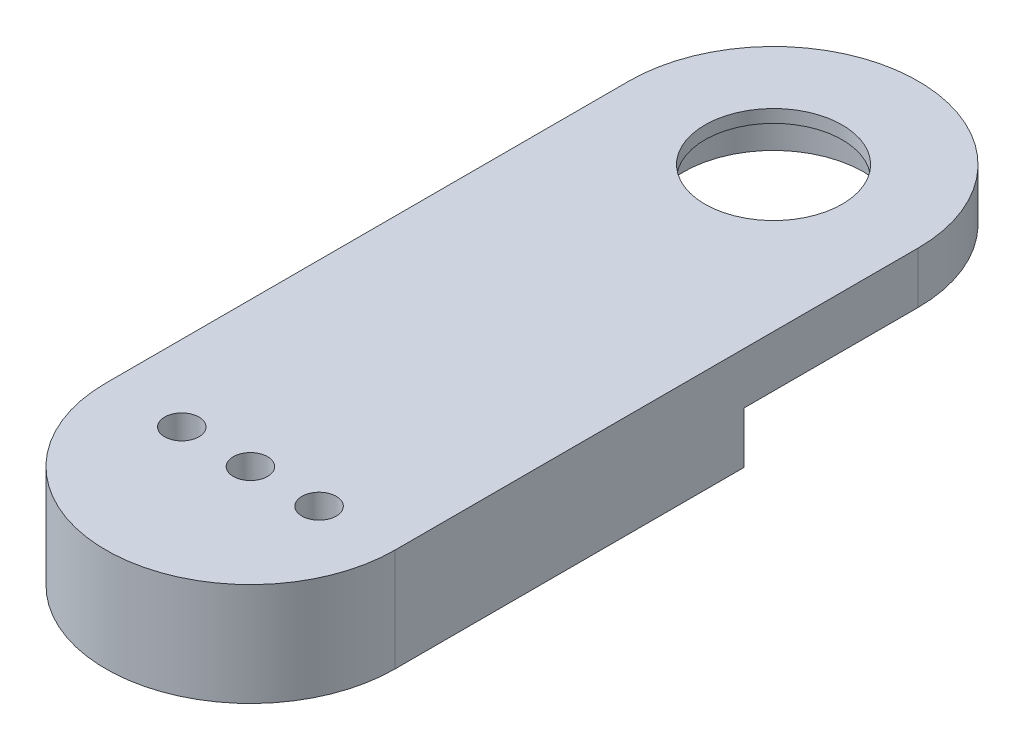
ISO-10303-21;
HEADER;
FILE_DESCRIPTION(('STEP AP214'),'2;1');
FILE_NAME('part.step','',(''),(''),'','','');
FILE_SCHEMA(('AUTOMOTIVE_DESIGN { 1 0 10303 214 1 1 1 1 }'));
ENDSEC;
DATA;
#1=APPLICATION_CONTEXT('core data for automotive mechanical design processes');
#2=APPLICATION_PROTOCOL_DEFINITION('international standard','automotive_design',2000,#1);
#3=PRODUCT_CONTEXT('',#1,'mechanical');
#4=PRODUCT('Part','Part','',(#3));
#5=PRODUCT_RELATED_PRODUCT_CATEGORY('part','',(#4));
#6=PRODUCT_DEFINITION_FORMATION('','',#4);
#7=PRODUCT_DEFINITION_CONTEXT('part definition',#1,'design');
#8=PRODUCT_DEFINITION('design','',#6,#7);
#9=PRODUCT_DEFINITION_SHAPE('','',#8);
#10=(LENGTH_UNIT() NAMED_UNIT(*) SI_UNIT(.MILLI.,.METRE.));
#11=(NAMED_UNIT(*) PLANE_ANGLE_UNIT() SI_UNIT($,.RADIAN.));
#12=(NAMED_UNIT(*) SI_UNIT($,.STERADIAN.) SOLID_ANGLE_UNIT());
#13=UNCERTAINTY_MEASURE_WITH_UNIT(LENGTH_MEASURE(1.E-05),#10,'distance_accuracy_value','');
#14=(GEOMETRIC_REPRESENTATION_CONTEXT(3) GLOBAL_UNCERTAINTY_ASSIGNED_CONTEXT((#13)) GLOBAL_UNIT_ASSIGNED_CONTEXT((#10,
#11,#12)) REPRESENTATION_CONTEXT('',''));
#15=CARTESIAN_POINT('',(0.,0.,0.));
#16=DIRECTION('',(0.,0.,1.));
#17=DIRECTION('',(1.,0.,0.));
#18=AXIS2_PLACEMENT_3D('',#15,#16,#17);
#19=CARTESIAN_POINT('',(0.,12.,-60.96));
#20=DIRECTION('',(0.,-1.,0.));
#21=DIRECTION('',(0.,0.,-1.));
#22=AXIS2_PLACEMENT_3D('',#19,#20,#21);
#23=CYLINDRICAL_SURFACE('',#22,10.499999955);
#24=CARTESIAN_POINT('',(0.,6.,-60.96));
#25=DIRECTION('',(0.,-1.,0.));
#26=DIRECTION('',(0.,0.,-1.));
#27=AXIS2_PLACEMENT_3D('',#24,#25,#26);
#28=CIRCLE('',#27,10.499999955);
#29=CARTESIAN_POINT('',(0.,6.,-71.459999955));
#30=VERTEX_POINT('',#29);
#31=EDGE_CURVE('E149',#30,#30,#28,.F.);
#32=ORIENTED_EDGE('',*,*,#31,.F.);
#33=EDGE_LOOP('',(#32));
#34=FACE_BOUND('',#33,.T.);
#35=CARTESIAN_POINT('',(0.,10.5,-60.96));
#36=DIRECTION('',(0.,1.,0.));
#37=DIRECTION('',(0.,0.,1.));
#38=AXIS2_PLACEMENT_3D('',#35,#36,#37);
#39=CIRCLE('',#38,10.499999955);
#40=CARTESIAN_POINT('',(0.,10.5,-50.460000045));
#41=VERTEX_POINT('',#40);
#42=EDGE_CURVE('E154',#41,#41,#39,.T.);
#43=ORIENTED_EDGE('',*,*,#42,.T.);
#44=EDGE_LOOP('',(#43));
#45=FACE_BOUND('',#44,.T.);
#46=ADVANCED_FACE('F34',(#34,#45),#23,.F.);
#47=CARTESIAN_POINT('',(0.,0.,0.));
#48=DIRECTION('',(0.,1.,0.));
#49=DIRECTION('',(0.,0.,1.));
#50=AXIS2_PLACEMENT_3D('',#47,#48,#49);
#51=PLANE('',#50);
#52=CARTESIAN_POINT('',(0.,0.,0.));
#53=DIRECTION('',(0.,1.,0.));
#54=DIRECTION('',(0.,0.,1.));
#55=AXIS2_PLACEMENT_3D('',#52,#53,#54);
#56=CIRCLE('',#55,2.);
#57=CARTESIAN_POINT('',(0.,0.,2.));
#58=VERTEX_POINT('',#57);
#59=EDGE_CURVE('E141',#58,#58,#56,.T.);
#60=ORIENTED_EDGE('',*,*,#59,.T.);
#61=EDGE_LOOP('',(#60));
#62=FACE_BOUND('',#61,.T.);
#63=CARTESIAN_POINT('',(8.,0.,0.));
#64=DIRECTION('',(0.,1.,0.));
#65=DIRECTION('',(0.,0.,1.));
#66=AXIS2_PLACEMENT_3D('',#63,#64,#65);
#67=CIRCLE('',#66,2.);
#68=CARTESIAN_POINT('',(8.,0.,2.));
#69=VERTEX_POINT('',#68);
#70=EDGE_CURVE('E135',#69,#69,#67,.T.);
#71=ORIENTED_EDGE('',*,*,#70,.T.);
#72=EDGE_LOOP('',(#71));
#73=FACE_BOUND('',#72,.T.);
#74=CARTESIAN_POINT('',(-8.,0.,0.));
#75=DIRECTION('',(0.,1.,0.));
#76=DIRECTION('',(0.,0.,1.));
#77=AXIS2_PLACEMENT_3D('',#74,#75,#76);
#78=CIRCLE('',#77,2.);
#79=CARTESIAN_POINT('',(-8.,0.,2.));
#80=VERTEX_POINT('',#79);
#81=EDGE_CURVE('E129',#80,#80,#78,.T.);
#82=ORIENTED_EDGE('',*,*,#81,.T.);
#83=EDGE_LOOP('',(#82));
#84=FACE_BOUND('',#83,.T.);
#85=DIRECTION('',(1.,0.,0.));
#86=VECTOR('',#85,1.);
#87=CARTESIAN_POINT('',(0.,0.,-40.64));
#88=LINE('',#87,#86);
#89=CARTESIAN_POINT('',(-16.85,0.,-40.64));
#90=VERTEX_POINT('',#89);
#91=CARTESIAN_POINT('',(16.85,0.,-40.64));
#92=VERTEX_POINT('',#91);
#93=EDGE_CURVE('E151',#90,#92,#88,.T.);
#94=ORIENTED_EDGE('',*,*,#93,.T.);
#95=DIRECTION('',(0.,0.,-1.));
#96=VECTOR('',#95,1.);
#97=CARTESIAN_POINT('',(16.85,0.,0.));
#98=LINE('',#97,#96);
#99=CARTESIAN_POINT('',(16.85,0.,0.));
#100=VERTEX_POINT('',#99);
#101=EDGE_CURVE('E117',#100,#92,#98,.T.);
#102=ORIENTED_EDGE('',*,*,#101,.F.);
#103=CARTESIAN_POINT('',(0.,0.,0.));
#104=DIRECTION('',(0.,1.,0.));
#105=DIRECTION('',(0.,0.,1.));
#106=AXIS2_PLACEMENT_3D('',#103,#104,#105);
#107=CIRCLE('',#106,16.85);
#108=CARTESIAN_POINT('',(-16.85,0.,0.));
#109=VERTEX_POINT('',#108);
#110=EDGE_CURVE('E120',#109,#100,#107,.T.);
#111=ORIENTED_EDGE('',*,*,#110,.F.);
#112=DIRECTION('',(0.,0.,1.));
#113=VECTOR('',#112,1.);
#114=CARTESIAN_POINT('',(-16.85,0.,0.));
#115=LINE('',#114,#113);
#116=EDGE_CURVE('E73',#90,#109,#115,.T.);
#117=ORIENTED_EDGE('',*,*,#116,.F.);
#118=EDGE_LOOP('',(#94,#102,#111,#117));
#119=FACE_BOUND('',#118,.T.);
#120=ADVANCED_FACE('F192',(#62,#73,#84,#119),#51,.F.);
#121=CARTESIAN_POINT('',(16.85,12.,0.));
#122=DIRECTION('',(-1.,0.,0.));
#123=DIRECTION('',(0.,0.,1.));
#124=AXIS2_PLACEMENT_3D('',#121,#122,#123);
#125=PLANE('',#124);
#126=DIRECTION('',(0.,-1.,0.));
#127=VECTOR('',#126,1.);
#128=CARTESIAN_POINT('',(16.85,6.,-40.64));
#129=LINE('',#128,#127);
#130=CARTESIAN_POINT('',(16.85,6.,-40.64));
#131=VERTEX_POINT('',#130);
#132=EDGE_CURVE('E144',#131,#92,#129,.T.);
#133=ORIENTED_EDGE('',*,*,#132,.F.);
#134=DIRECTION('',(0.,0.,1.));
#135=VECTOR('',#134,1.);
#136=CARTESIAN_POINT('',(16.85,6.,0.));
#137=LINE('',#136,#135);
#138=CARTESIAN_POINT('',(16.85,6.,-60.96));
#139=VERTEX_POINT('',#138);
#140=EDGE_CURVE('E108',#139,#131,#137,.T.);
#141=ORIENTED_EDGE('',*,*,#140,.F.);
#142=DIRECTION('',(0.,-1.,0.));
#143=VECTOR('',#142,1.);
#144=CARTESIAN_POINT('',(16.85,12.,-60.96));
#145=LINE('',#144,#143);
#146=CARTESIAN_POINT('',(16.85,12.,-60.96));
#147=VERTEX_POINT('',#146);
#148=EDGE_CURVE('E42',#147,#139,#145,.T.);
#149=ORIENTED_EDGE('',*,*,#148,.F.);
#150=DIRECTION('',(0.,0.,-1.));
#151=VECTOR('',#150,1.);
#152=CARTESIAN_POINT('',(16.85,12.,0.));
#153=LINE('',#152,#151);
#154=CARTESIAN_POINT('',(16.85,12.,0.));
#155=VERTEX_POINT('',#154);
#156=EDGE_CURVE('E80',#155,#147,#153,.T.);
#157=ORIENTED_EDGE('',*,*,#156,.F.);
#158=DIRECTION('',(0.,-1.,0.));
#159=VECTOR('',#158,1.);
#160=CARTESIAN_POINT('',(16.85,12.,0.));
#161=LINE('',#160,#159);
#162=EDGE_CURVE('E11',#155,#100,#161,.T.);
#163=ORIENTED_EDGE('',*,*,#162,.T.);
#164=ORIENTED_EDGE('',*,*,#101,.T.);
#165=EDGE_LOOP('',(#133,#141,#149,#157,#163,#164));
#166=FACE_BOUND('',#165,.T.);
#167=ADVANCED_FACE('F197',(#166),#125,.F.);
#168=CARTESIAN_POINT('',(0.,12.,-60.96));
#169=DIRECTION('',(0.,-1.,0.));
#170=DIRECTION('',(0.,0.,-1.));
#171=AXIS2_PLACEMENT_3D('',#168,#169,#170);
#172=CYLINDRICAL_SURFACE('',#171,16.85);
#173=CARTESIAN_POINT('',(0.,6.,-60.96));
#174=DIRECTION('',(0.,-1.,0.));
#175=DIRECTION('',(0.,0.,-1.));
#176=AXIS2_PLACEMENT_3D('',#173,#174,#175);
#177=CIRCLE('',#176,16.85);
#178=CARTESIAN_POINT('',(-16.85,6.,-60.96));
#179=VERTEX_POINT('',#178);
#180=EDGE_CURVE('E98',#179,#139,#177,.T.);
#181=ORIENTED_EDGE('',*,*,#180,.F.);
#182=DIRECTION('',(0.,-1.,0.));
#183=VECTOR('',#182,1.);
#184=CARTESIAN_POINT('',(-16.85,12.,-60.96));
#185=LINE('',#184,#183);
#186=CARTESIAN_POINT('',(-16.85,12.,-60.96));
#187=VERTEX_POINT('',#186);
#188=EDGE_CURVE('E107',#187,#179,#185,.T.);
#189=ORIENTED_EDGE('',*,*,#188,.F.);
#190=CARTESIAN_POINT('',(0.,12.,-60.96));
#191=DIRECTION('',(0.,1.,0.));
#192=DIRECTION('',(0.,0.,1.));
#193=AXIS2_PLACEMENT_3D('',#190,#191,#192);
#194=CIRCLE('',#193,16.85);
#195=EDGE_CURVE('E125',#147,#187,#194,.T.);
#196=ORIENTED_EDGE('',*,*,#195,.F.);
#197=ORIENTED_EDGE('',*,*,#148,.T.);
#198=EDGE_LOOP('',(#181,#189,#196,#197));
#199=FACE_BOUND('',#198,.T.);
#200=ADVANCED_FACE('F105',(#199),#172,.T.);
#201=CARTESIAN_POINT('',(-16.85,12.,0.));
#202=DIRECTION('',(1.,0.,0.));
#203=DIRECTION('',(0.,0.,-1.));
#204=AXIS2_PLACEMENT_3D('',#201,#202,#203);
#205=PLANE('',#204);
#206=DIRECTION('',(0.,-1.,0.));
#207=VECTOR('',#206,1.);
#208=CARTESIAN_POINT('',(-16.85,6.,-40.64));
#209=LINE('',#208,#207);
#210=CARTESIAN_POINT('',(-16.85,6.,-40.64));
#211=VERTEX_POINT('',#210);
#212=EDGE_CURVE('E147',#211,#90,#209,.T.);
#213=ORIENTED_EDGE('',*,*,#212,.T.);
#214=ORIENTED_EDGE('',*,*,#116,.T.);
#215=DIRECTION('',(0.,-1.,0.));
#216=VECTOR('',#215,1.);
#217=CARTESIAN_POINT('',(-16.85,12.,0.));
#218=LINE('',#217,#216);
#219=CARTESIAN_POINT('',(-16.85,12.,0.));
#220=VERTEX_POINT('',#219);
#221=EDGE_CURVE('E111',#220,#109,#218,.T.);
#222=ORIENTED_EDGE('',*,*,#221,.F.);
#223=DIRECTION('',(0.,0.,1.));
#224=VECTOR('',#223,1.);
#225=CARTESIAN_POINT('',(-16.85,12.,0.));
#226=LINE('',#225,#224);
#227=EDGE_CURVE('E58',#187,#220,#226,.T.);
#228=ORIENTED_EDGE('',*,*,#227,.F.);
#229=ORIENTED_EDGE('',*,*,#188,.T.);
#230=DIRECTION('',(0.,0.,-1.));
#231=VECTOR('',#230,1.);
#232=CARTESIAN_POINT('',(-16.85,6.,0.));
#233=LINE('',#232,#231);
#234=EDGE_CURVE('E94',#211,#179,#233,.T.);
#235=ORIENTED_EDGE('',*,*,#234,.F.);
#236=EDGE_LOOP('',(#213,#214,#222,#228,#229,#235));
#237=FACE_BOUND('',#236,.T.);
#238=ADVANCED_FACE('F110',(#237),#205,.F.);
#239=CARTESIAN_POINT('',(0.,12.,0.));
#240=DIRECTION('',(0.,1.,0.));
#241=DIRECTION('',(0.,0.,1.));
#242=AXIS2_PLACEMENT_3D('',#239,#240,#241);
#243=PLANE('',#242);
#244=CARTESIAN_POINT('',(8.,12.,0.));
#245=DIRECTION('',(0.,1.,0.));
#246=DIRECTION('',(0.,0.,1.));
#247=AXIS2_PLACEMENT_3D('',#244,#245,#246);
#248=CIRCLE('',#247,2.);
#249=CARTESIAN_POINT('',(8.,12.,2.));
#250=VERTEX_POINT('',#249);
#251=EDGE_CURVE('E132',#250,#250,#248,.T.);
#252=ORIENTED_EDGE('',*,*,#251,.F.);
#253=EDGE_LOOP('',(#252));
#254=FACE_BOUND('',#253,.T.);
#255=CARTESIAN_POINT('',(0.,12.,0.));
#256=DIRECTION('',(0.,1.,0.));
#257=DIRECTION('',(0.,0.,1.));
#258=AXIS2_PLACEMENT_3D('',#255,#256,#257);
#259=CIRCLE('',#258,16.85);
#260=EDGE_CURVE('E116',#220,#155,#259,.T.);
#261=ORIENTED_EDGE('',*,*,#260,.T.);
#262=ORIENTED_EDGE('',*,*,#156,.T.);
#263=ORIENTED_EDGE('',*,*,#195,.T.);
#264=ORIENTED_EDGE('',*,*,#227,.T.);
#265=EDGE_LOOP('',(#261,#262,#263,#264));
#266=FACE_BOUND('',#265,.T.);
#267=CARTESIAN_POINT('',(-8.,12.,0.));
#268=DIRECTION('',(0.,1.,0.));
#269=DIRECTION('',(0.,0.,1.));
#270=AXIS2_PLACEMENT_3D('',#267,#268,#269);
#271=CIRCLE('',#270,2.);
#272=CARTESIAN_POINT('',(-8.,12.,2.));
#273=VERTEX_POINT('',#272);
#274=EDGE_CURVE('E123',#273,#273,#271,.T.);
#275=ORIENTED_EDGE('',*,*,#274,.F.);
#276=EDGE_LOOP('',(#275));
#277=FACE_BOUND('',#276,.T.);
#278=CARTESIAN_POINT('',(0.,12.,0.));
#279=DIRECTION('',(0.,1.,0.));
#280=DIRECTION('',(0.,0.,1.));
#281=AXIS2_PLACEMENT_3D('',#278,#279,#280);
#282=CIRCLE('',#281,2.);
#283=CARTESIAN_POINT('',(0.,12.,2.));
#284=VERTEX_POINT('',#283);
#285=EDGE_CURVE('E138',#284,#284,#282,.T.);
#286=ORIENTED_EDGE('',*,*,#285,.F.);
#287=EDGE_LOOP('',(#286));
#288=FACE_BOUND('',#287,.T.);
#289=CARTESIAN_POINT('',(0.,12.,-60.96));
#290=DIRECTION('',(0.,1.,0.));
#291=DIRECTION('',(0.,0.,1.));
#292=AXIS2_PLACEMENT_3D('',#289,#290,#291);
#293=CIRCLE('',#292,8.);
#294=CARTESIAN_POINT('',(0.,12.,-52.96));
#295=VERTEX_POINT('',#294);
#296=EDGE_CURVE('E162',#295,#295,#293,.T.);
#297=ORIENTED_EDGE('',*,*,#296,.F.);
#298=EDGE_LOOP('',(#297));
#299=FACE_BOUND('',#298,.T.);
#300=ADVANCED_FACE('F177',(#254,#266,#277,#288,#299),#243,.T.);
#301=CARTESIAN_POINT('',(0.,12.,0.));
#302=DIRECTION('',(0.,-1.,0.));
#303=DIRECTION('',(0.,0.,-1.));
#304=AXIS2_PLACEMENT_3D('',#301,#302,#303);
#305=CYLINDRICAL_SURFACE('',#304,16.85);
#306=ORIENTED_EDGE('',*,*,#110,.T.);
#307=ORIENTED_EDGE('',*,*,#162,.F.);
#308=ORIENTED_EDGE('',*,*,#260,.F.);
#309=ORIENTED_EDGE('',*,*,#221,.T.);
#310=EDGE_LOOP('',(#306,#307,#308,#309));
#311=FACE_BOUND('',#310,.T.);
#312=ADVANCED_FACE('F36',(#311),#305,.T.);
#313=CARTESIAN_POINT('',(-8.,12.,0.));
#314=DIRECTION('',(0.,-1.,0.));
#315=DIRECTION('',(0.,0.,-1.));
#316=AXIS2_PLACEMENT_3D('',#313,#314,#315);
#317=CYLINDRICAL_SURFACE('',#316,2.);
#318=ORIENTED_EDGE('',*,*,#274,.T.);
#319=EDGE_LOOP('',(#318));
#320=FACE_BOUND('',#319,.T.);
#321=ORIENTED_EDGE('',*,*,#81,.F.);
#322=EDGE_LOOP('',(#321));
#323=FACE_BOUND('',#322,.T.);
#324=ADVANCED_FACE('F185',(#320,#323),#317,.F.);
#325=CARTESIAN_POINT('',(8.,12.,0.));
#326=DIRECTION('',(0.,-1.,0.));
#327=DIRECTION('',(0.,0.,-1.));
#328=AXIS2_PLACEMENT_3D('',#325,#326,#327);
#329=CYLINDRICAL_SURFACE('',#328,2.);
#330=ORIENTED_EDGE('',*,*,#251,.T.);
#331=EDGE_LOOP('',(#330));
#332=FACE_BOUND('',#331,.T.);
#333=ORIENTED_EDGE('',*,*,#70,.F.);
#334=EDGE_LOOP('',(#333));
#335=FACE_BOUND('',#334,.T.);
#336=ADVANCED_FACE('F204',(#332,#335),#329,.F.);
#337=CARTESIAN_POINT('',(0.,12.,0.));
#338=DIRECTION('',(0.,-1.,0.));
#339=DIRECTION('',(0.,0.,-1.));
#340=AXIS2_PLACEMENT_3D('',#337,#338,#339);
#341=CYLINDRICAL_SURFACE('',#340,2.);
#342=ORIENTED_EDGE('',*,*,#285,.T.);
#343=EDGE_LOOP('',(#342));
#344=FACE_BOUND('',#343,.T.);
#345=ORIENTED_EDGE('',*,*,#59,.F.);
#346=EDGE_LOOP('',(#345));
#347=FACE_BOUND('',#346,.T.);
#348=ADVANCED_FACE('F208',(#344,#347),#341,.F.);
#349=CARTESIAN_POINT('',(0.,6.,-40.64));
#350=DIRECTION('',(0.,0.,-1.));
#351=DIRECTION('',(-1.,0.,0.));
#352=AXIS2_PLACEMENT_3D('',#349,#350,#351);
#353=PLANE('',#352);
#354=ORIENTED_EDGE('',*,*,#93,.F.);
#355=ORIENTED_EDGE('',*,*,#212,.F.);
#356=DIRECTION('',(1.,0.,0.));
#357=VECTOR('',#356,1.);
#358=CARTESIAN_POINT('',(0.,6.,-40.64));
#359=LINE('',#358,#357);
#360=EDGE_CURVE('E49',#211,#131,#359,.T.);
#361=ORIENTED_EDGE('',*,*,#360,.T.);
#362=ORIENTED_EDGE('',*,*,#132,.T.);
#363=EDGE_LOOP('',(#354,#355,#361,#362));
#364=FACE_BOUND('',#363,.T.);
#365=ADVANCED_FACE('F212',(#364),#353,.T.);
#366=CARTESIAN_POINT('',(0.,6.,0.));
#367=DIRECTION('',(0.,-1.,0.));
#368=DIRECTION('',(0.,0.,-1.));
#369=AXIS2_PLACEMENT_3D('',#366,#367,#368);
#370=PLANE('',#369);
#371=ORIENTED_EDGE('',*,*,#360,.F.);
#372=ORIENTED_EDGE('',*,*,#234,.T.);
#373=ORIENTED_EDGE('',*,*,#180,.T.);
#374=ORIENTED_EDGE('',*,*,#140,.T.);
#375=EDGE_LOOP('',(#371,#372,#373,#374));
#376=FACE_BOUND('',#375,.T.);
#377=ORIENTED_EDGE('',*,*,#31,.T.);
#378=EDGE_LOOP('',(#377));
#379=FACE_BOUND('',#378,.T.);
#380=ADVANCED_FACE('F96',(#376,#379),#370,.T.);
#381=CARTESIAN_POINT('',(0.,10.5,-60.96));
#382=DIRECTION('',(0.,1.,0.));
#383=DIRECTION('',(0.,0.,1.));
#384=AXIS2_PLACEMENT_3D('',#381,#382,#383);
#385=PLANE('',#384);
#386=CARTESIAN_POINT('',(0.,10.5,-60.96));
#387=DIRECTION('',(0.,1.,0.));
#388=DIRECTION('',(0.,0.,1.));
#389=AXIS2_PLACEMENT_3D('',#386,#387,#388);
#390=CIRCLE('',#389,8.);
#391=CARTESIAN_POINT('',(0.,10.5,-52.96));
#392=VERTEX_POINT('',#391);
#393=EDGE_CURVE('E161',#392,#392,#390,.T.);
#394=ORIENTED_EDGE('',*,*,#393,.T.);
#395=EDGE_LOOP('',(#394));
#396=FACE_BOUND('',#395,.T.);
#397=ORIENTED_EDGE('',*,*,#42,.F.);
#398=EDGE_LOOP('',(#397));
#399=FACE_BOUND('',#398,.T.);
#400=ADVANCED_FACE('F168',(#396,#399),#385,.F.);
#401=CARTESIAN_POINT('',(0.,10.5,-60.96));
#402=DIRECTION('',(0.,1.,0.));
#403=DIRECTION('',(0.,0.,1.));
#404=AXIS2_PLACEMENT_3D('',#401,#402,#403);
#405=CYLINDRICAL_SURFACE('',#404,8.);
#406=ORIENTED_EDGE('',*,*,#393,.F.);
#407=EDGE_LOOP('',(#406));
#408=FACE_BOUND('',#407,.T.);
#409=ORIENTED_EDGE('',*,*,#296,.T.);
#410=EDGE_LOOP('',(#409));
#411=FACE_BOUND('',#410,.T.);
#412=ADVANCED_FACE('F171',(#408,#411),#405,.F.);
#413=CLOSED_SHELL('',(#46,#120,#167,#200,#238,#300,#312,#324,#336,#348,#365,#380,#400,#412));
#414=MANIFOLD_SOLID_BREP('B2',#413);
#415=ADVANCED_BREP_SHAPE_REPRESENTATION('',(#18,#414),#14);
#416=SHAPE_DEFINITION_REPRESENTATION(#9,#415);
ENDSEC;
END-ISO-10303-21;
